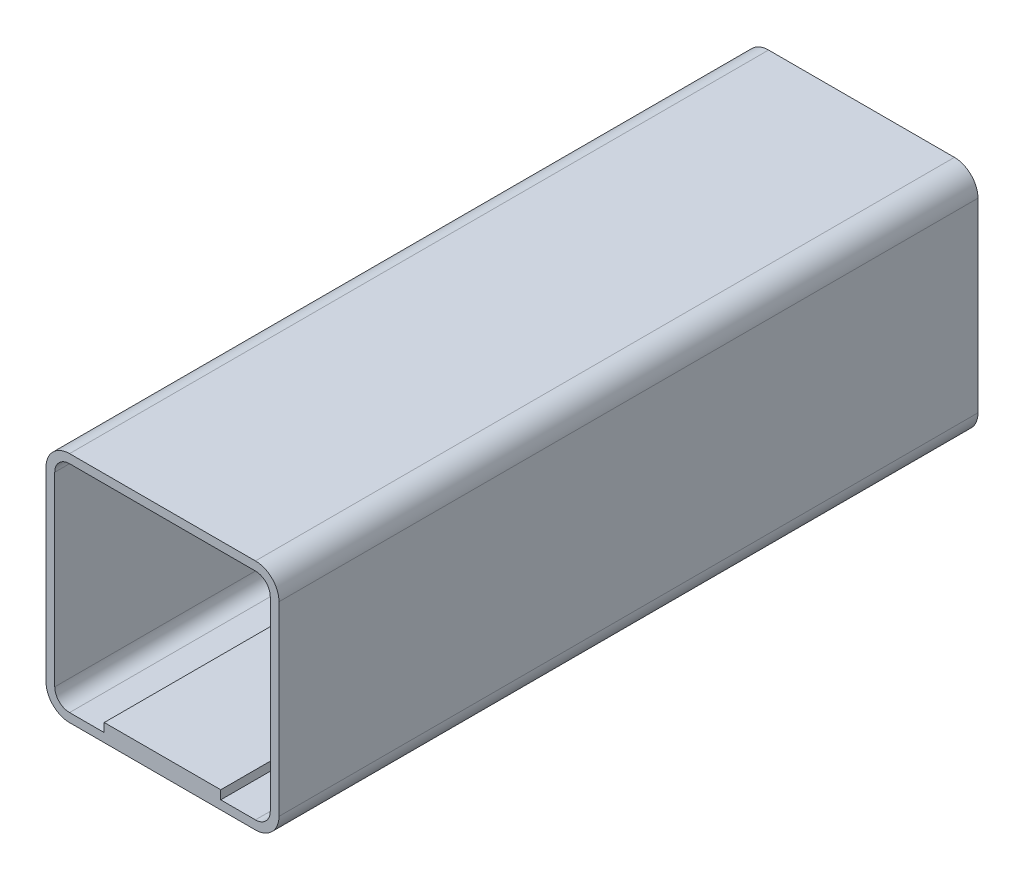
ISO-10303-21;
HEADER;
FILE_DESCRIPTION(('STEP AP214'),'2;1');
FILE_NAME('part.step','',(''),(''),'','','');
FILE_SCHEMA(('AUTOMOTIVE_DESIGN { 1 0 10303 214 1 1 1 1 }'));
ENDSEC;
DATA;
#1=APPLICATION_CONTEXT('core data for automotive mechanical design processes');
#2=APPLICATION_PROTOCOL_DEFINITION('international standard','automotive_design',2000,#1);
#3=PRODUCT_CONTEXT('',#1,'mechanical');
#4=PRODUCT('Part','Part','',(#3));
#5=PRODUCT_RELATED_PRODUCT_CATEGORY('part','',(#4));
#6=PRODUCT_DEFINITION_FORMATION('','',#4);
#7=PRODUCT_DEFINITION_CONTEXT('part definition',#1,'design');
#8=PRODUCT_DEFINITION('design','',#6,#7);
#9=PRODUCT_DEFINITION_SHAPE('','',#8);
#10=(LENGTH_UNIT() NAMED_UNIT(*) SI_UNIT(.MILLI.,.METRE.));
#11=(NAMED_UNIT(*) PLANE_ANGLE_UNIT() SI_UNIT($,.RADIAN.));
#12=(NAMED_UNIT(*) SI_UNIT($,.STERADIAN.) SOLID_ANGLE_UNIT());
#13=UNCERTAINTY_MEASURE_WITH_UNIT(LENGTH_MEASURE(1.E-05),#10,'distance_accuracy_value','');
#14=(GEOMETRIC_REPRESENTATION_CONTEXT(3) GLOBAL_UNCERTAINTY_ASSIGNED_CONTEXT((#13)) GLOBAL_UNIT_ASSIGNED_CONTEXT((#10,
#11,#12)) REPRESENTATION_CONTEXT('',''));
#15=CARTESIAN_POINT('',(0.,0.,0.));
#16=DIRECTION('',(0.,0.,1.));
#17=DIRECTION('',(1.,0.,0.));
#18=AXIS2_PLACEMENT_3D('',#15,#16,#17);
#19=CARTESIAN_POINT('',(-50.6524288909317,-58.7375,-381.));
#20=DIRECTION('',(0.,-1.,0.));
#21=DIRECTION('',(1.,0.,0.));
#22=AXIS2_PLACEMENT_3D('',#19,#20,#21);
#23=PLANE('',#22);
#24=DIRECTION('',(1.,0.,0.));
#25=VECTOR('',#24,1.);
#26=CARTESIAN_POINT('',(-50.6524288909317,-58.7375,0.));
#27=LINE('',#26,#25);
#28=CARTESIAN_POINT('',(-50.6524288909317,-58.7375,0.));
#29=VERTEX_POINT('',#28);
#30=CARTESIAN_POINT('',(-31.75,-58.7375,0.));
#31=VERTEX_POINT('',#30);
#32=EDGE_CURVE('E246',#29,#31,#27,.T.);
#33=ORIENTED_EDGE('',*,*,#32,.T.);
#34=DIRECTION('',(0.,0.,1.));
#35=VECTOR('',#34,1.);
#36=CARTESIAN_POINT('',(-31.75,-58.7375,-444.678343306418));
#37=LINE('',#36,#35);
#38=CARTESIAN_POINT('',(-31.75,-58.7375,-381.));
#39=VERTEX_POINT('',#38);
#40=EDGE_CURVE('E190',#39,#31,#37,.T.);
#41=ORIENTED_EDGE('',*,*,#40,.F.);
#42=DIRECTION('',(1.,0.,0.));
#43=VECTOR('',#42,1.);
#44=CARTESIAN_POINT('',(-50.6524288909317,-58.7375,-381.));
#45=LINE('',#44,#43);
#46=CARTESIAN_POINT('',(-50.6524288909317,-58.7375,-381.));
#47=VERTEX_POINT('',#46);
#48=EDGE_CURVE('E187',#47,#39,#45,.T.);
#49=ORIENTED_EDGE('',*,*,#48,.F.);
#50=DIRECTION('',(0.,0.,1.));
#51=VECTOR('',#50,1.);
#52=CARTESIAN_POINT('',(-50.6524288909317,-58.7375,-381.));
#53=LINE('',#52,#51);
#54=EDGE_CURVE('E234',#47,#29,#53,.T.);
#55=ORIENTED_EDGE('',*,*,#54,.T.);
#56=EDGE_LOOP('',(#33,#41,#49,#55));
#57=FACE_BOUND('',#56,.T.);
#58=ADVANCED_FACE('F39',(#57),#23,.F.);
#59=CARTESIAN_POINT('',(-50.6524288909317,50.6524288909317,-381.));
#60=DIRECTION('',(0.,0.,1.));
#61=DIRECTION('',(1.,0.,0.));
#62=AXIS2_PLACEMENT_3D('',#59,#60,#61);
#63=CYLINDRICAL_SURFACE('',#62,12.8475711090683);
#64=CARTESIAN_POINT('',(-50.6524288909317,50.6524288909317,0.));
#65=DIRECTION('',(0.,0.,-1.));
#66=DIRECTION('',(-1.,0.,0.));
#67=AXIS2_PLACEMENT_3D('',#64,#65,#66);
#68=CIRCLE('',#67,12.8475711090683);
#69=CARTESIAN_POINT('',(-63.5,50.6524288909317,0.));
#70=VERTEX_POINT('',#69);
#71=CARTESIAN_POINT('',(-50.6524288909317,63.5,0.));
#72=VERTEX_POINT('',#71);
#73=EDGE_CURVE('E220',#70,#72,#68,.T.);
#74=ORIENTED_EDGE('',*,*,#73,.T.);
#75=DIRECTION('',(0.,0.,1.));
#76=VECTOR('',#75,1.);
#77=CARTESIAN_POINT('',(-50.6524288909317,63.5,-381.));
#78=LINE('',#77,#76);
#79=CARTESIAN_POINT('',(-50.6524288909317,63.5,-381.));
#80=VERTEX_POINT('',#79);
#81=EDGE_CURVE('E11',#80,#72,#78,.T.);
#82=ORIENTED_EDGE('',*,*,#81,.F.);
#83=CARTESIAN_POINT('',(-50.6524288909317,50.6524288909317,-381.));
#84=DIRECTION('',(0.,0.,-1.));
#85=DIRECTION('',(-1.,0.,0.));
#86=AXIS2_PLACEMENT_3D('',#83,#84,#85);
#87=CIRCLE('',#86,12.8475711090683);
#88=CARTESIAN_POINT('',(-63.5,50.6524288909317,-381.));
#89=VERTEX_POINT('',#88);
#90=EDGE_CURVE('E277',#89,#80,#87,.T.);
#91=ORIENTED_EDGE('',*,*,#90,.F.);
#92=DIRECTION('',(0.,0.,1.));
#93=VECTOR('',#92,1.);
#94=CARTESIAN_POINT('',(-63.5,50.6524288909317,-381.));
#95=LINE('',#94,#93);
#96=EDGE_CURVE('E299',#89,#70,#95,.T.);
#97=ORIENTED_EDGE('',*,*,#96,.T.);
#98=EDGE_LOOP('',(#74,#82,#91,#97));
#99=FACE_BOUND('',#98,.T.);
#100=ADVANCED_FACE('F41',(#99),#63,.T.);
#101=CARTESIAN_POINT('',(-50.6524288909317,63.5,-381.));
#102=DIRECTION('',(0.,-1.,0.));
#103=DIRECTION('',(0.,0.,-1.));
#104=AXIS2_PLACEMENT_3D('',#101,#102,#103);
#105=PLANE('',#104);
#106=DIRECTION('',(1.,0.,0.));
#107=VECTOR('',#106,1.);
#108=CARTESIAN_POINT('',(-50.6524288909317,63.5,0.));
#109=LINE('',#108,#107);
#110=CARTESIAN_POINT('',(50.6524288909317,63.5,0.));
#111=VERTEX_POINT('',#110);
#112=EDGE_CURVE('E302',#72,#111,#109,.T.);
#113=ORIENTED_EDGE('',*,*,#112,.T.);
#114=DIRECTION('',(0.,0.,1.));
#115=VECTOR('',#114,1.);
#116=CARTESIAN_POINT('',(50.6524288909317,63.5,-381.));
#117=LINE('',#116,#115);
#118=CARTESIAN_POINT('',(50.6524288909317,63.5,-381.));
#119=VERTEX_POINT('',#118);
#120=EDGE_CURVE('E47',#119,#111,#117,.T.);
#121=ORIENTED_EDGE('',*,*,#120,.F.);
#122=DIRECTION('',(1.,0.,0.));
#123=VECTOR('',#122,1.);
#124=CARTESIAN_POINT('',(-50.6524288909317,63.5,-381.));
#125=LINE('',#124,#123);
#126=EDGE_CURVE('E280',#80,#119,#125,.T.);
#127=ORIENTED_EDGE('',*,*,#126,.F.);
#128=ORIENTED_EDGE('',*,*,#81,.T.);
#129=EDGE_LOOP('',(#113,#121,#127,#128));
#130=FACE_BOUND('',#129,.T.);
#131=ADVANCED_FACE('F338',(#130),#105,.F.);
#132=CARTESIAN_POINT('',(50.6524288909317,50.6524288909317,-381.));
#133=DIRECTION('',(0.,0.,1.));
#134=DIRECTION('',(1.,0.,0.));
#135=AXIS2_PLACEMENT_3D('',#132,#133,#134);
#136=CYLINDRICAL_SURFACE('',#135,12.8475711090683);
#137=CARTESIAN_POINT('',(50.6524288909317,50.6524288909317,0.));
#138=DIRECTION('',(0.,0.,1.));
#139=DIRECTION('',(1.,0.,0.));
#140=AXIS2_PLACEMENT_3D('',#137,#138,#139);
#141=CIRCLE('',#140,12.8475711090683);
#142=CARTESIAN_POINT('',(63.5,50.6524288909317,0.));
#143=VERTEX_POINT('',#142);
#144=EDGE_CURVE('E305',#143,#111,#141,.T.);
#145=ORIENTED_EDGE('',*,*,#144,.F.);
#146=DIRECTION('',(0.,0.,1.));
#147=VECTOR('',#146,1.);
#148=CARTESIAN_POINT('',(63.5,50.6524288909317,-381.));
#149=LINE('',#148,#147);
#150=CARTESIAN_POINT('',(63.5,50.6524288909317,-381.));
#151=VERTEX_POINT('',#150);
#152=EDGE_CURVE('E331',#151,#143,#149,.T.);
#153=ORIENTED_EDGE('',*,*,#152,.F.);
#154=CARTESIAN_POINT('',(50.6524288909317,50.6524288909317,-381.));
#155=DIRECTION('',(0.,0.,1.));
#156=DIRECTION('',(1.,0.,0.));
#157=AXIS2_PLACEMENT_3D('',#154,#155,#156);
#158=CIRCLE('',#157,12.8475711090683);
#159=EDGE_CURVE('E283',#151,#119,#158,.T.);
#160=ORIENTED_EDGE('',*,*,#159,.T.);
#161=ORIENTED_EDGE('',*,*,#120,.T.);
#162=EDGE_LOOP('',(#145,#153,#160,#161));
#163=FACE_BOUND('',#162,.T.);
#164=ADVANCED_FACE('F335',(#163),#136,.T.);
#165=CARTESIAN_POINT('',(63.5,50.6524288909317,-381.));
#166=DIRECTION('',(-1.,0.,0.));
#167=DIRECTION('',(0.,-1.,0.));
#168=AXIS2_PLACEMENT_3D('',#165,#166,#167);
#169=PLANE('',#168);
#170=DIRECTION('',(0.,-1.,0.));
#171=VECTOR('',#170,1.);
#172=CARTESIAN_POINT('',(63.5,50.6524288909317,0.));
#173=LINE('',#172,#171);
#174=CARTESIAN_POINT('',(63.5,-50.6524288909317,0.));
#175=VERTEX_POINT('',#174);
#176=EDGE_CURVE('E308',#143,#175,#173,.T.);
#177=ORIENTED_EDGE('',*,*,#176,.T.);
#178=DIRECTION('',(0.,0.,1.));
#179=VECTOR('',#178,1.);
#180=CARTESIAN_POINT('',(63.5,-50.6524288909317,-381.));
#181=LINE('',#180,#179);
#182=CARTESIAN_POINT('',(63.5,-50.6524288909317,-381.));
#183=VERTEX_POINT('',#182);
#184=EDGE_CURVE('E329',#183,#175,#181,.T.);
#185=ORIENTED_EDGE('',*,*,#184,.F.);
#186=DIRECTION('',(0.,-1.,0.));
#187=VECTOR('',#186,1.);
#188=CARTESIAN_POINT('',(63.5,50.6524288909317,-381.));
#189=LINE('',#188,#187);
#190=EDGE_CURVE('E286',#151,#183,#189,.T.);
#191=ORIENTED_EDGE('',*,*,#190,.F.);
#192=ORIENTED_EDGE('',*,*,#152,.T.);
#193=EDGE_LOOP('',(#177,#185,#191,#192));
#194=FACE_BOUND('',#193,.T.);
#195=ADVANCED_FACE('F347',(#194),#169,.F.);
#196=CARTESIAN_POINT('',(50.6524288909317,-50.6524288909317,-381.));
#197=DIRECTION('',(0.,0.,1.));
#198=DIRECTION('',(1.,0.,0.));
#199=AXIS2_PLACEMENT_3D('',#196,#197,#198);
#200=CYLINDRICAL_SURFACE('',#199,12.8475711090683);
#201=CARTESIAN_POINT('',(50.6524288909317,-50.6524288909317,0.));
#202=DIRECTION('',(0.,0.,1.));
#203=DIRECTION('',(1.,0.,0.));
#204=AXIS2_PLACEMENT_3D('',#201,#202,#203);
#205=CIRCLE('',#204,12.8475711090683);
#206=CARTESIAN_POINT('',(50.6524288909317,-63.5,0.));
#207=VERTEX_POINT('',#206);
#208=EDGE_CURVE('E311',#207,#175,#205,.T.);
#209=ORIENTED_EDGE('',*,*,#208,.F.);
#210=DIRECTION('',(0.,0.,1.));
#211=VECTOR('',#210,1.);
#212=CARTESIAN_POINT('',(50.6524288909317,-63.5,-381.));
#213=LINE('',#212,#211);
#214=CARTESIAN_POINT('',(50.6524288909317,-63.5,-381.));
#215=VERTEX_POINT('',#214);
#216=EDGE_CURVE('E327',#215,#207,#213,.T.);
#217=ORIENTED_EDGE('',*,*,#216,.F.);
#218=CARTESIAN_POINT('',(50.6524288909317,-50.6524288909317,-381.));
#219=DIRECTION('',(0.,0.,1.));
#220=DIRECTION('',(1.,0.,0.));
#221=AXIS2_PLACEMENT_3D('',#218,#219,#220);
#222=CIRCLE('',#221,12.8475711090683);
#223=EDGE_CURVE('E288',#215,#183,#222,.T.);
#224=ORIENTED_EDGE('',*,*,#223,.T.);
#225=ORIENTED_EDGE('',*,*,#184,.T.);
#226=EDGE_LOOP('',(#209,#217,#224,#225));
#227=FACE_BOUND('',#226,.T.);
#228=ADVANCED_FACE('F366',(#227),#200,.T.);
#229=CARTESIAN_POINT('',(-50.6524288909317,-63.5,-381.));
#230=DIRECTION('',(0.,-1.,0.));
#231=DIRECTION('',(1.,0.,0.));
#232=AXIS2_PLACEMENT_3D('',#229,#230,#231);
#233=PLANE('',#232);
#234=DIRECTION('',(1.,0.,0.));
#235=VECTOR('',#234,1.);
#236=CARTESIAN_POINT('',(-50.6524288909317,-63.5,0.));
#237=LINE('',#236,#235);
#238=CARTESIAN_POINT('',(-50.6524288909317,-63.5,0.));
#239=VERTEX_POINT('',#238);
#240=EDGE_CURVE('E314',#239,#207,#237,.T.);
#241=ORIENTED_EDGE('',*,*,#240,.F.);
#242=DIRECTION('',(0.,0.,1.));
#243=VECTOR('',#242,1.);
#244=CARTESIAN_POINT('',(-50.6524288909317,-63.5,-381.));
#245=LINE('',#244,#243);
#246=CARTESIAN_POINT('',(-50.6524288909317,-63.5,-381.));
#247=VERTEX_POINT('',#246);
#248=EDGE_CURVE('E325',#247,#239,#245,.T.);
#249=ORIENTED_EDGE('',*,*,#248,.F.);
#250=DIRECTION('',(1.,0.,0.));
#251=VECTOR('',#250,1.);
#252=CARTESIAN_POINT('',(-50.6524288909317,-63.5,-381.));
#253=LINE('',#252,#251);
#254=EDGE_CURVE('E291',#247,#215,#253,.T.);
#255=ORIENTED_EDGE('',*,*,#254,.T.);
#256=ORIENTED_EDGE('',*,*,#216,.T.);
#257=EDGE_LOOP('',(#241,#249,#255,#256));
#258=FACE_BOUND('',#257,.T.);
#259=ADVANCED_FACE('F363',(#258),#233,.T.);
#260=CARTESIAN_POINT('',(-50.6524288909317,-50.6524288909317,-381.));
#261=DIRECTION('',(0.,0.,1.));
#262=DIRECTION('',(1.,0.,0.));
#263=AXIS2_PLACEMENT_3D('',#260,#261,#262);
#264=CYLINDRICAL_SURFACE('',#263,12.8475711090683);
#265=CARTESIAN_POINT('',(-50.6524288909317,-50.6524288909317,0.));
#266=DIRECTION('',(0.,0.,-1.));
#267=DIRECTION('',(-1.,0.,0.));
#268=AXIS2_PLACEMENT_3D('',#265,#266,#267);
#269=CIRCLE('',#268,12.8475711090683);
#270=CARTESIAN_POINT('',(-63.5,-50.6524288909317,0.));
#271=VERTEX_POINT('',#270);
#272=EDGE_CURVE('E317',#239,#271,#269,.T.);
#273=ORIENTED_EDGE('',*,*,#272,.T.);
#274=DIRECTION('',(0.,0.,1.));
#275=VECTOR('',#274,1.);
#276=CARTESIAN_POINT('',(-63.5,-50.6524288909317,-381.));
#277=LINE('',#276,#275);
#278=CARTESIAN_POINT('',(-63.5,-50.6524288909317,-381.));
#279=VERTEX_POINT('',#278);
#280=EDGE_CURVE('E323',#279,#271,#277,.T.);
#281=ORIENTED_EDGE('',*,*,#280,.F.);
#282=CARTESIAN_POINT('',(-50.6524288909317,-50.6524288909317,-381.));
#283=DIRECTION('',(0.,0.,-1.));
#284=DIRECTION('',(-1.,0.,0.));
#285=AXIS2_PLACEMENT_3D('',#282,#283,#284);
#286=CIRCLE('',#285,12.8475711090683);
#287=EDGE_CURVE('E294',#247,#279,#286,.T.);
#288=ORIENTED_EDGE('',*,*,#287,.F.);
#289=ORIENTED_EDGE('',*,*,#248,.T.);
#290=EDGE_LOOP('',(#273,#281,#288,#289));
#291=FACE_BOUND('',#290,.T.);
#292=ADVANCED_FACE('F360',(#291),#264,.T.);
#293=CARTESIAN_POINT('',(-63.5,50.6524288909317,-381.));
#294=DIRECTION('',(-1.,0.,0.));
#295=DIRECTION('',(0.,0.,1.));
#296=AXIS2_PLACEMENT_3D('',#293,#294,#295);
#297=PLANE('',#296);
#298=DIRECTION('',(0.,-1.,0.));
#299=VECTOR('',#298,1.);
#300=CARTESIAN_POINT('',(-63.5,50.6524288909317,0.));
#301=LINE('',#300,#299);
#302=EDGE_CURVE('E281',#70,#271,#301,.T.);
#303=ORIENTED_EDGE('',*,*,#302,.F.);
#304=ORIENTED_EDGE('',*,*,#96,.F.);
#305=DIRECTION('',(0.,-1.,0.));
#306=VECTOR('',#305,1.);
#307=CARTESIAN_POINT('',(-63.5,50.6524288909317,-381.));
#308=LINE('',#307,#306);
#309=EDGE_CURVE('E296',#89,#279,#308,.T.);
#310=ORIENTED_EDGE('',*,*,#309,.T.);
#311=ORIENTED_EDGE('',*,*,#280,.T.);
#312=EDGE_LOOP('',(#303,#304,#310,#311));
#313=FACE_BOUND('',#312,.T.);
#314=ADVANCED_FACE('F356',(#313),#297,.T.);
#315=CARTESIAN_POINT('',(-50.6524288909317,50.6524288909317,-381.));
#316=DIRECTION('',(0.,0.,-1.));
#317=DIRECTION('',(-1.,0.,0.));
#318=AXIS2_PLACEMENT_3D('',#315,#316,#317);
#319=PLANE('',#318);
#320=CARTESIAN_POINT('',(-50.6524288909317,50.6524288909317,-381.));
#321=DIRECTION('',(0.,0.,-1.));
#322=DIRECTION('',(-1.,0.,0.));
#323=AXIS2_PLACEMENT_3D('',#320,#321,#322);
#324=CIRCLE('',#323,8.08507110906827);
#325=CARTESIAN_POINT('',(-58.7375,50.6524288909317,-381.));
#326=VERTEX_POINT('',#325);
#327=CARTESIAN_POINT('',(-50.6524288909317,58.7375,-381.));
#328=VERTEX_POINT('',#327);
#329=EDGE_CURVE('E242',#326,#328,#324,.T.);
#330=ORIENTED_EDGE('',*,*,#329,.F.);
#331=DIRECTION('',(0.,-1.,0.));
#332=VECTOR('',#331,1.);
#333=CARTESIAN_POINT('',(-58.7375,50.6524288909317,-381.));
#334=LINE('',#333,#332);
#335=CARTESIAN_POINT('',(-58.7375,-50.6524288909317,-381.));
#336=VERTEX_POINT('',#335);
#337=EDGE_CURVE('E224',#326,#336,#334,.T.);
#338=ORIENTED_EDGE('',*,*,#337,.T.);
#339=CARTESIAN_POINT('',(-50.6524288909317,-50.6524288909317,-381.));
#340=DIRECTION('',(0.,0.,-1.));
#341=DIRECTION('',(-1.,0.,0.));
#342=AXIS2_PLACEMENT_3D('',#339,#340,#341);
#343=CIRCLE('',#342,8.0850711090683);
#344=EDGE_CURVE('E273',#47,#336,#343,.T.);
#345=ORIENTED_EDGE('',*,*,#344,.F.);
#346=ORIENTED_EDGE('',*,*,#48,.T.);
#347=DIRECTION('',(0.,-1.,0.));
#348=VECTOR('',#347,1.);
#349=CARTESIAN_POINT('',(-31.75,-58.7375,-381.));
#350=LINE('',#349,#348);
#351=CARTESIAN_POINT('',(-31.75,-53.975,-381.));
#352=VERTEX_POINT('',#351);
#353=EDGE_CURVE('E177',#352,#39,#350,.T.);
#354=ORIENTED_EDGE('',*,*,#353,.F.);
#355=DIRECTION('',(-1.,0.,0.));
#356=VECTOR('',#355,1.);
#357=CARTESIAN_POINT('',(-31.75,-53.975,-381.));
#358=LINE('',#357,#356);
#359=CARTESIAN_POINT('',(31.75,-53.975,-381.));
#360=VERTEX_POINT('',#359);
#361=EDGE_CURVE('E183',#360,#352,#358,.T.);
#362=ORIENTED_EDGE('',*,*,#361,.F.);
#363=DIRECTION('',(0.,1.,0.));
#364=VECTOR('',#363,1.);
#365=CARTESIAN_POINT('',(31.75,-53.975,-381.));
#366=LINE('',#365,#364);
#367=CARTESIAN_POINT('',(31.75,-58.7375,-381.));
#368=VERTEX_POINT('',#367);
#369=EDGE_CURVE('E210',#368,#360,#366,.T.);
#370=ORIENTED_EDGE('',*,*,#369,.F.);
#371=CARTESIAN_POINT('',(50.6524288909317,-58.7375,-381.));
#372=VERTEX_POINT('',#371);
#373=EDGE_CURVE('E271',#368,#372,#45,.T.);
#374=ORIENTED_EDGE('',*,*,#373,.T.);
#375=CARTESIAN_POINT('',(50.6524288909317,-50.6524288909317,-381.));
#376=DIRECTION('',(0.,0.,-1.));
#377=DIRECTION('',(-1.,0.,0.));
#378=AXIS2_PLACEMENT_3D('',#375,#376,#377);
#379=CIRCLE('',#378,8.0850711090683);
#380=CARTESIAN_POINT('',(58.7375,-50.6524288909317,-381.));
#381=VERTEX_POINT('',#380);
#382=EDGE_CURVE('E268',#372,#381,#379,.F.);
#383=ORIENTED_EDGE('',*,*,#382,.T.);
#384=DIRECTION('',(0.,-1.,0.));
#385=VECTOR('',#384,1.);
#386=CARTESIAN_POINT('',(58.7375,50.6524288909317,-381.));
#387=LINE('',#386,#385);
#388=CARTESIAN_POINT('',(58.7375,50.6524288909317,-381.));
#389=VERTEX_POINT('',#388);
#390=EDGE_CURVE('E266',#389,#381,#387,.T.);
#391=ORIENTED_EDGE('',*,*,#390,.F.);
#392=CARTESIAN_POINT('',(50.6524288909317,50.6524288909317,-381.));
#393=DIRECTION('',(0.,0.,-1.));
#394=DIRECTION('',(-1.,0.,0.));
#395=AXIS2_PLACEMENT_3D('',#392,#393,#394);
#396=CIRCLE('',#395,8.08507110906828);
#397=CARTESIAN_POINT('',(50.6524288909317,58.7375,-381.));
#398=VERTEX_POINT('',#397);
#399=EDGE_CURVE('E263',#389,#398,#396,.F.);
#400=ORIENTED_EDGE('',*,*,#399,.T.);
#401=DIRECTION('',(1.,0.,0.));
#402=VECTOR('',#401,1.);
#403=CARTESIAN_POINT('',(-50.6524288909317,58.7375,-381.));
#404=LINE('',#403,#402);
#405=EDGE_CURVE('E261',#328,#398,#404,.T.);
#406=ORIENTED_EDGE('',*,*,#405,.F.);
#407=EDGE_LOOP('',(#330,#338,#345,#346,#354,#362,#370,#374,#383,#391,#400,#406));
#408=FACE_BOUND('',#407,.T.);
#409=ORIENTED_EDGE('',*,*,#90,.T.);
#410=ORIENTED_EDGE('',*,*,#126,.T.);
#411=ORIENTED_EDGE('',*,*,#159,.F.);
#412=ORIENTED_EDGE('',*,*,#190,.T.);
#413=ORIENTED_EDGE('',*,*,#223,.F.);
#414=ORIENTED_EDGE('',*,*,#254,.F.);
#415=ORIENTED_EDGE('',*,*,#287,.T.);
#416=ORIENTED_EDGE('',*,*,#309,.F.);
#417=EDGE_LOOP('',(#409,#410,#411,#412,#413,#414,#415,#416));
#418=FACE_BOUND('',#417,.T.);
#419=ADVANCED_FACE('F180',(#408,#418),#319,.T.);
#420=CARTESIAN_POINT('',(-50.6524288909317,50.6524288909317,0.));
#421=DIRECTION('',(0.,0.,-1.));
#422=DIRECTION('',(-1.,0.,0.));
#423=AXIS2_PLACEMENT_3D('',#420,#421,#422);
#424=PLANE('',#423);
#425=DIRECTION('',(0.,-1.,0.));
#426=VECTOR('',#425,1.);
#427=CARTESIAN_POINT('',(-58.7375,50.6524288909317,0.));
#428=LINE('',#427,#426);
#429=CARTESIAN_POINT('',(-58.7375,50.6524288909317,0.));
#430=VERTEX_POINT('',#429);
#431=CARTESIAN_POINT('',(-58.7375,-50.6524288909317,0.));
#432=VERTEX_POINT('',#431);
#433=EDGE_CURVE('E240',#430,#432,#428,.T.);
#434=ORIENTED_EDGE('',*,*,#433,.F.);
#435=CARTESIAN_POINT('',(-50.6524288909317,50.6524288909317,0.));
#436=DIRECTION('',(0.,0.,-1.));
#437=DIRECTION('',(-1.,0.,0.));
#438=AXIS2_PLACEMENT_3D('',#435,#436,#437);
#439=CIRCLE('',#438,8.08507110906827);
#440=CARTESIAN_POINT('',(-50.6524288909317,58.7375,0.));
#441=VERTEX_POINT('',#440);
#442=EDGE_CURVE('E216',#430,#441,#439,.T.);
#443=ORIENTED_EDGE('',*,*,#442,.T.);
#444=DIRECTION('',(1.,0.,0.));
#445=VECTOR('',#444,1.);
#446=CARTESIAN_POINT('',(-50.6524288909317,58.7375,0.));
#447=LINE('',#446,#445);
#448=CARTESIAN_POINT('',(50.6524288909317,58.7375,0.));
#449=VERTEX_POINT('',#448);
#450=EDGE_CURVE('E239',#441,#449,#447,.T.);
#451=ORIENTED_EDGE('',*,*,#450,.T.);
#452=CARTESIAN_POINT('',(50.6524288909317,50.6524288909317,0.));
#453=DIRECTION('',(0.,0.,-1.));
#454=DIRECTION('',(-1.,0.,0.));
#455=AXIS2_PLACEMENT_3D('',#452,#453,#454);
#456=CIRCLE('',#455,8.08507110906828);
#457=CARTESIAN_POINT('',(58.7375,50.6524288909317,0.));
#458=VERTEX_POINT('',#457);
#459=EDGE_CURVE('E256',#458,#449,#456,.F.);
#460=ORIENTED_EDGE('',*,*,#459,.F.);
#461=DIRECTION('',(0.,-1.,0.));
#462=VECTOR('',#461,1.);
#463=CARTESIAN_POINT('',(58.7375,50.6524288909317,0.));
#464=LINE('',#463,#462);
#465=CARTESIAN_POINT('',(58.7375,-50.6524288909317,0.));
#466=VERTEX_POINT('',#465);
#467=EDGE_CURVE('E253',#458,#466,#464,.T.);
#468=ORIENTED_EDGE('',*,*,#467,.T.);
#469=CARTESIAN_POINT('',(50.6524288909317,-50.6524288909317,0.));
#470=DIRECTION('',(0.,0.,-1.));
#471=DIRECTION('',(-1.,0.,0.));
#472=AXIS2_PLACEMENT_3D('',#469,#470,#471);
#473=CIRCLE('',#472,8.0850711090683);
#474=CARTESIAN_POINT('',(50.6524288909317,-58.7375,0.));
#475=VERTEX_POINT('',#474);
#476=EDGE_CURVE('E250',#475,#466,#473,.F.);
#477=ORIENTED_EDGE('',*,*,#476,.F.);
#478=CARTESIAN_POINT('',(31.75,-58.7375,0.));
#479=VERTEX_POINT('',#478);
#480=EDGE_CURVE('E249',#479,#475,#27,.T.);
#481=ORIENTED_EDGE('',*,*,#480,.F.);
#482=DIRECTION('',(0.,1.,0.));
#483=VECTOR('',#482,1.);
#484=CARTESIAN_POINT('',(31.75,-53.975,0.));
#485=LINE('',#484,#483);
#486=CARTESIAN_POINT('',(31.75,-53.975,0.));
#487=VERTEX_POINT('',#486);
#488=EDGE_CURVE('E54',#479,#487,#485,.T.);
#489=ORIENTED_EDGE('',*,*,#488,.T.);
#490=DIRECTION('',(-1.,0.,0.));
#491=VECTOR('',#490,1.);
#492=CARTESIAN_POINT('',(-31.75,-53.975,0.));
#493=LINE('',#492,#491);
#494=CARTESIAN_POINT('',(-31.75,-53.975,0.));
#495=VERTEX_POINT('',#494);
#496=EDGE_CURVE('E205',#487,#495,#493,.T.);
#497=ORIENTED_EDGE('',*,*,#496,.T.);
#498=DIRECTION('',(0.,-1.,0.));
#499=VECTOR('',#498,1.);
#500=CARTESIAN_POINT('',(-31.75,-58.7375,0.));
#501=LINE('',#500,#499);
#502=EDGE_CURVE('E196',#495,#31,#501,.T.);
#503=ORIENTED_EDGE('',*,*,#502,.T.);
#504=ORIENTED_EDGE('',*,*,#32,.F.);
#505=CARTESIAN_POINT('',(-50.6524288909317,-50.6524288909317,0.));
#506=DIRECTION('',(0.,0.,-1.));
#507=DIRECTION('',(-1.,0.,0.));
#508=AXIS2_PLACEMENT_3D('',#505,#506,#507);
#509=CIRCLE('',#508,8.0850711090683);
#510=EDGE_CURVE('E243',#29,#432,#509,.T.);
#511=ORIENTED_EDGE('',*,*,#510,.T.);
#512=EDGE_LOOP('',(#434,#443,#451,#460,#468,#477,#481,#489,#497,#503,#504,#511));
#513=FACE_BOUND('',#512,.T.);
#514=ORIENTED_EDGE('',*,*,#73,.F.);
#515=ORIENTED_EDGE('',*,*,#302,.T.);
#516=ORIENTED_EDGE('',*,*,#272,.F.);
#517=ORIENTED_EDGE('',*,*,#240,.T.);
#518=ORIENTED_EDGE('',*,*,#208,.T.);
#519=ORIENTED_EDGE('',*,*,#176,.F.);
#520=ORIENTED_EDGE('',*,*,#144,.T.);
#521=ORIENTED_EDGE('',*,*,#112,.F.);
#522=EDGE_LOOP('',(#514,#515,#516,#517,#518,#519,#520,#521));
#523=FACE_BOUND('',#522,.T.);
#524=ADVANCED_FACE('F343',(#513,#523),#424,.F.);
#525=CARTESIAN_POINT('',(-50.6524288909317,50.6524288909317,-381.));
#526=DIRECTION('',(0.,0.,1.));
#527=DIRECTION('',(1.,0.,0.));
#528=AXIS2_PLACEMENT_3D('',#525,#526,#527);
#529=CYLINDRICAL_SURFACE('',#528,8.08507110906827);
#530=ORIENTED_EDGE('',*,*,#442,.F.);
#531=DIRECTION('',(0.,0.,1.));
#532=VECTOR('',#531,1.);
#533=CARTESIAN_POINT('',(-58.7375,50.6524288909317,-381.));
#534=LINE('',#533,#532);
#535=EDGE_CURVE('E222',#326,#430,#534,.T.);
#536=ORIENTED_EDGE('',*,*,#535,.F.);
#537=ORIENTED_EDGE('',*,*,#329,.T.);
#538=DIRECTION('',(0.,0.,-1.));
#539=VECTOR('',#538,1.);
#540=CARTESIAN_POINT('',(-50.6524288909317,58.7375,-381.));
#541=LINE('',#540,#539);
#542=EDGE_CURVE('E217',#328,#441,#541,.F.);
#543=ORIENTED_EDGE('',*,*,#542,.T.);
#544=EDGE_LOOP('',(#530,#536,#537,#543));
#545=FACE_BOUND('',#544,.T.);
#546=ADVANCED_FACE('F414',(#545),#529,.F.);
#547=CARTESIAN_POINT('',(-50.6524288909317,58.7375,-381.));
#548=DIRECTION('',(0.,-1.,0.));
#549=DIRECTION('',(0.,0.,-1.));
#550=AXIS2_PLACEMENT_3D('',#547,#548,#549);
#551=PLANE('',#550);
#552=ORIENTED_EDGE('',*,*,#450,.F.);
#553=ORIENTED_EDGE('',*,*,#542,.F.);
#554=ORIENTED_EDGE('',*,*,#405,.T.);
#555=DIRECTION('',(0.,0.,1.));
#556=VECTOR('',#555,1.);
#557=CARTESIAN_POINT('',(50.6524288909317,58.7375,-381.));
#558=LINE('',#557,#556);
#559=EDGE_CURVE('E221',#398,#449,#558,.T.);
#560=ORIENTED_EDGE('',*,*,#559,.T.);
#561=EDGE_LOOP('',(#552,#553,#554,#560));
#562=FACE_BOUND('',#561,.T.);
#563=ADVANCED_FACE('F417',(#562),#551,.T.);
#564=CARTESIAN_POINT('',(50.6524288909317,50.6524288909317,-381.));
#565=DIRECTION('',(0.,0.,1.));
#566=DIRECTION('',(1.,0.,0.));
#567=AXIS2_PLACEMENT_3D('',#564,#565,#566);
#568=CYLINDRICAL_SURFACE('',#567,8.08507110906828);
#569=ORIENTED_EDGE('',*,*,#459,.T.);
#570=ORIENTED_EDGE('',*,*,#559,.F.);
#571=ORIENTED_EDGE('',*,*,#399,.F.);
#572=DIRECTION('',(0.,0.,1.));
#573=VECTOR('',#572,1.);
#574=CARTESIAN_POINT('',(58.7375,50.6524288909317,-381.));
#575=LINE('',#574,#573);
#576=EDGE_CURVE('E227',#389,#458,#575,.T.);
#577=ORIENTED_EDGE('',*,*,#576,.T.);
#578=EDGE_LOOP('',(#569,#570,#571,#577));
#579=FACE_BOUND('',#578,.T.);
#580=ADVANCED_FACE('F421',(#579),#568,.F.);
#581=CARTESIAN_POINT('',(58.7375,50.6524288909317,-381.));
#582=DIRECTION('',(-1.,0.,0.));
#583=DIRECTION('',(0.,-1.,0.));
#584=AXIS2_PLACEMENT_3D('',#581,#582,#583);
#585=PLANE('',#584);
#586=ORIENTED_EDGE('',*,*,#467,.F.);
#587=ORIENTED_EDGE('',*,*,#576,.F.);
#588=ORIENTED_EDGE('',*,*,#390,.T.);
#589=DIRECTION('',(0.,0.,1.));
#590=VECTOR('',#589,1.);
#591=CARTESIAN_POINT('',(58.7375,-50.6524288909317,-381.));
#592=LINE('',#591,#590);
#593=EDGE_CURVE('E229',#381,#466,#592,.T.);
#594=ORIENTED_EDGE('',*,*,#593,.T.);
#595=EDGE_LOOP('',(#586,#587,#588,#594));
#596=FACE_BOUND('',#595,.T.);
#597=ADVANCED_FACE('F398',(#596),#585,.T.);
#598=CARTESIAN_POINT('',(50.6524288909317,-50.6524288909317,-381.));
#599=DIRECTION('',(0.,0.,1.));
#600=DIRECTION('',(1.,0.,0.));
#601=AXIS2_PLACEMENT_3D('',#598,#599,#600);
#602=CYLINDRICAL_SURFACE('',#601,8.0850711090683);
#603=ORIENTED_EDGE('',*,*,#476,.T.);
#604=ORIENTED_EDGE('',*,*,#593,.F.);
#605=ORIENTED_EDGE('',*,*,#382,.F.);
#606=DIRECTION('',(0.,0.,1.));
#607=VECTOR('',#606,1.);
#608=CARTESIAN_POINT('',(50.6524288909317,-58.7375,-381.));
#609=LINE('',#608,#607);
#610=EDGE_CURVE('E231',#372,#475,#609,.T.);
#611=ORIENTED_EDGE('',*,*,#610,.T.);
#612=EDGE_LOOP('',(#603,#604,#605,#611));
#613=FACE_BOUND('',#612,.T.);
#614=ADVANCED_FACE('F388',(#613),#602,.F.);
#615=ORIENTED_EDGE('',*,*,#373,.F.);
#616=DIRECTION('',(0.,0.,1.));
#617=VECTOR('',#616,1.);
#618=CARTESIAN_POINT('',(31.75,-58.7375,-444.678343306418));
#619=LINE('',#618,#617);
#620=EDGE_CURVE('E211',#368,#479,#619,.T.);
#621=ORIENTED_EDGE('',*,*,#620,.T.);
#622=ORIENTED_EDGE('',*,*,#480,.T.);
#623=ORIENTED_EDGE('',*,*,#610,.F.);
#624=EDGE_LOOP('',(#615,#621,#622,#623));
#625=FACE_BOUND('',#624,.T.);
#626=ADVANCED_FACE('F378',(#625),#23,.F.);
#627=CARTESIAN_POINT('',(-50.6524288909317,-50.6524288909317,-381.));
#628=DIRECTION('',(0.,0.,1.));
#629=DIRECTION('',(1.,0.,0.));
#630=AXIS2_PLACEMENT_3D('',#627,#628,#629);
#631=CYLINDRICAL_SURFACE('',#630,8.0850711090683);
#632=ORIENTED_EDGE('',*,*,#510,.F.);
#633=ORIENTED_EDGE('',*,*,#54,.F.);
#634=ORIENTED_EDGE('',*,*,#344,.T.);
#635=DIRECTION('',(0.,0.,1.));
#636=VECTOR('',#635,1.);
#637=CARTESIAN_POINT('',(-58.7375,-50.6524288909317,-381.));
#638=LINE('',#637,#636);
#639=EDGE_CURVE('E62',#336,#432,#638,.T.);
#640=ORIENTED_EDGE('',*,*,#639,.T.);
#641=EDGE_LOOP('',(#632,#633,#634,#640));
#642=FACE_BOUND('',#641,.T.);
#643=ADVANCED_FACE('F387',(#642),#631,.F.);
#644=CARTESIAN_POINT('',(-58.7375,50.6524288909317,-381.));
#645=DIRECTION('',(-1.,0.,0.));
#646=DIRECTION('',(0.,0.,1.));
#647=AXIS2_PLACEMENT_3D('',#644,#645,#646);
#648=PLANE('',#647);
#649=ORIENTED_EDGE('',*,*,#433,.T.);
#650=ORIENTED_EDGE('',*,*,#639,.F.);
#651=ORIENTED_EDGE('',*,*,#337,.F.);
#652=ORIENTED_EDGE('',*,*,#535,.T.);
#653=EDGE_LOOP('',(#649,#650,#651,#652));
#654=FACE_BOUND('',#653,.T.);
#655=ADVANCED_FACE('F395',(#654),#648,.F.);
#656=CARTESIAN_POINT('',(-31.75,-53.975,-444.678343306418));
#657=DIRECTION('',(0.,1.,0.));
#658=DIRECTION('',(0.,0.,1.));
#659=AXIS2_PLACEMENT_3D('',#656,#657,#658);
#660=PLANE('',#659);
#661=DIRECTION('',(0.,0.,1.));
#662=VECTOR('',#661,1.);
#663=CARTESIAN_POINT('',(31.75,-53.975,-444.678343306418));
#664=LINE('',#663,#662);
#665=EDGE_CURVE('E203',#360,#487,#664,.T.);
#666=ORIENTED_EDGE('',*,*,#665,.F.);
#667=ORIENTED_EDGE('',*,*,#361,.T.);
#668=DIRECTION('',(0.,0.,1.));
#669=VECTOR('',#668,1.);
#670=CARTESIAN_POINT('',(-31.75,-53.975,-444.678343306418));
#671=LINE('',#670,#669);
#672=EDGE_CURVE('E191',#352,#495,#671,.T.);
#673=ORIENTED_EDGE('',*,*,#672,.T.);
#674=ORIENTED_EDGE('',*,*,#496,.F.);
#675=EDGE_LOOP('',(#666,#667,#673,#674));
#676=FACE_BOUND('',#675,.T.);
#677=ADVANCED_FACE('F202',(#676),#660,.T.);
#678=CARTESIAN_POINT('',(-31.75,-58.7375,-444.678343306418));
#679=DIRECTION('',(-1.,0.,0.));
#680=DIRECTION('',(0.,0.,1.));
#681=AXIS2_PLACEMENT_3D('',#678,#679,#680);
#682=PLANE('',#681);
#683=ORIENTED_EDGE('',*,*,#672,.F.);
#684=ORIENTED_EDGE('',*,*,#353,.T.);
#685=ORIENTED_EDGE('',*,*,#40,.T.);
#686=ORIENTED_EDGE('',*,*,#502,.F.);
#687=EDGE_LOOP('',(#683,#684,#685,#686));
#688=FACE_BOUND('',#687,.T.);
#689=ADVANCED_FACE('F194',(#688),#682,.T.);
#690=CARTESIAN_POINT('',(31.75,-53.975,-444.678343306418));
#691=DIRECTION('',(1.,0.,0.));
#692=DIRECTION('',(0.,0.,-1.));
#693=AXIS2_PLACEMENT_3D('',#690,#691,#692);
#694=PLANE('',#693);
#695=ORIENTED_EDGE('',*,*,#620,.F.);
#696=ORIENTED_EDGE('',*,*,#369,.T.);
#697=ORIENTED_EDGE('',*,*,#665,.T.);
#698=ORIENTED_EDGE('',*,*,#488,.F.);
#699=EDGE_LOOP('',(#695,#696,#697,#698));
#700=FACE_BOUND('',#699,.T.);
#701=ADVANCED_FACE('F405',(#700),#694,.T.);
#702=CLOSED_SHELL('',(#58,#100,#131,#164,#195,#228,#259,#292,#314,#419,#524,#546,#563,#580,#597,
#614,#626,#643,#655,#677,#689,#701));
#703=MANIFOLD_SOLID_BREP('B2',#702);
#704=ADVANCED_BREP_SHAPE_REPRESENTATION('',(#18,#703),#14);
#705=SHAPE_DEFINITION_REPRESENTATION(#9,#704);
ENDSEC;
END-ISO-10303-21;
